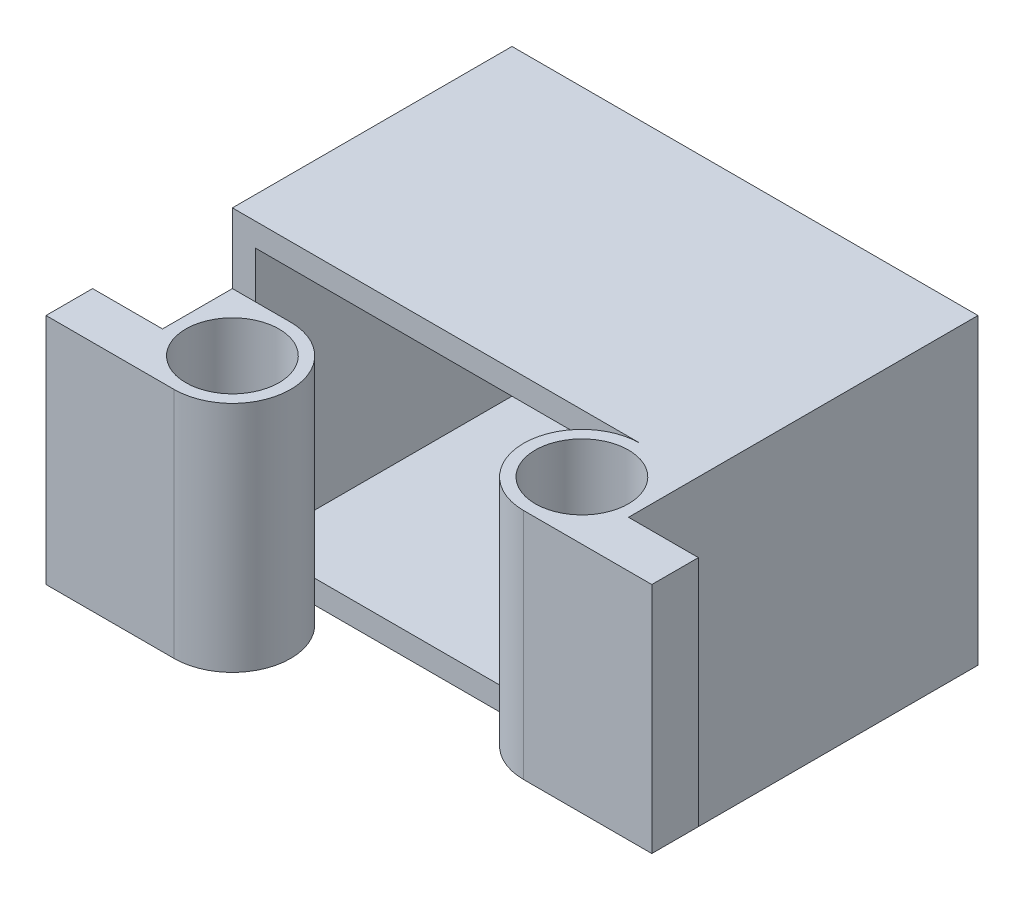
ISO-10303-21;
HEADER;
FILE_DESCRIPTION(('STEP AP214'),'2;1');
FILE_NAME('part.step','',(''),(''),'','','');
FILE_SCHEMA(('AUTOMOTIVE_DESIGN { 1 0 10303 214 1 1 1 1 }'));
ENDSEC;
DATA;
#1=APPLICATION_CONTEXT('core data for automotive mechanical design processes');
#2=APPLICATION_PROTOCOL_DEFINITION('international standard','automotive_design',2000,#1);
#3=PRODUCT_CONTEXT('',#1,'mechanical');
#4=PRODUCT('Part','Part','',(#3));
#5=PRODUCT_RELATED_PRODUCT_CATEGORY('part','',(#4));
#6=PRODUCT_DEFINITION_FORMATION('','',#4);
#7=PRODUCT_DEFINITION_CONTEXT('part definition',#1,'design');
#8=PRODUCT_DEFINITION('design','',#6,#7);
#9=PRODUCT_DEFINITION_SHAPE('','',#8);
#10=(LENGTH_UNIT() NAMED_UNIT(*) SI_UNIT(.MILLI.,.METRE.));
#11=(NAMED_UNIT(*) PLANE_ANGLE_UNIT() SI_UNIT($,.RADIAN.));
#12=(NAMED_UNIT(*) SI_UNIT($,.STERADIAN.) SOLID_ANGLE_UNIT());
#13=UNCERTAINTY_MEASURE_WITH_UNIT(LENGTH_MEASURE(1.E-05),#10,'distance_accuracy_value','');
#14=(GEOMETRIC_REPRESENTATION_CONTEXT(3) GLOBAL_UNCERTAINTY_ASSIGNED_CONTEXT((#13)) GLOBAL_UNIT_ASSIGNED_CONTEXT((#10,
#11,#12)) REPRESENTATION_CONTEXT('',''));
#15=CARTESIAN_POINT('',(0.,0.,0.));
#16=DIRECTION('',(0.,0.,1.));
#17=DIRECTION('',(1.,0.,0.));
#18=AXIS2_PLACEMENT_3D('',#15,#16,#17);
#19=CARTESIAN_POINT('',(20.,-13.,24.));
#20=DIRECTION('',(-1.,0.,0.));
#21=DIRECTION('',(0.,0.,1.));
#22=AXIS2_PLACEMENT_3D('',#19,#20,#21);
#23=PLANE('',#22);
#24=DIRECTION('',(0.,1.,0.));
#25=VECTOR('',#24,1.);
#26=CARTESIAN_POINT('',(20.,13.,30.));
#27=LINE('',#26,#25);
#28=CARTESIAN_POINT('',(20.,-7.,30.));
#29=VERTEX_POINT('',#28);
#30=CARTESIAN_POINT('',(20.,13.,30.));
#31=VERTEX_POINT('',#30);
#32=EDGE_CURVE('E55',#29,#31,#27,.T.);
#33=ORIENTED_EDGE('',*,*,#32,.F.);
#34=DIRECTION('',(0.,0.,1.));
#35=VECTOR('',#34,1.);
#36=CARTESIAN_POINT('',(20.,-7.,0.));
#37=LINE('',#36,#35);
#38=CARTESIAN_POINT('',(20.,-7.,24.));
#39=VERTEX_POINT('',#38);
#40=EDGE_CURVE('E189',#39,#29,#37,.T.);
#41=ORIENTED_EDGE('',*,*,#40,.F.);
#42=DIRECTION('',(0.,1.,0.));
#43=VECTOR('',#42,1.);
#44=CARTESIAN_POINT('',(20.,-13.,24.));
#45=LINE('',#44,#43);
#46=CARTESIAN_POINT('',(20.,-13.,24.));
#47=VERTEX_POINT('',#46);
#48=EDGE_CURVE('E280',#47,#39,#45,.T.);
#49=ORIENTED_EDGE('',*,*,#48,.F.);
#50=DIRECTION('',(0.,0.,-1.));
#51=VECTOR('',#50,1.);
#52=CARTESIAN_POINT('',(20.,-13.,24.));
#53=LINE('',#52,#51);
#54=CARTESIAN_POINT('',(20.,-13.,0.));
#55=VERTEX_POINT('',#54);
#56=EDGE_CURVE('E291',#47,#55,#53,.T.);
#57=ORIENTED_EDGE('',*,*,#56,.T.);
#58=DIRECTION('',(0.,1.,0.));
#59=VECTOR('',#58,1.);
#60=CARTESIAN_POINT('',(20.,-13.,0.));
#61=LINE('',#60,#59);
#62=CARTESIAN_POINT('',(20.,13.,0.));
#63=VERTEX_POINT('',#62);
#64=EDGE_CURVE('E252',#55,#63,#61,.T.);
#65=ORIENTED_EDGE('',*,*,#64,.T.);
#66=DIRECTION('',(0.,0.,-1.));
#67=VECTOR('',#66,1.);
#68=CARTESIAN_POINT('',(20.,13.,24.));
#69=LINE('',#68,#67);
#70=EDGE_CURVE('E305',#31,#63,#69,.T.);
#71=ORIENTED_EDGE('',*,*,#70,.F.);
#72=EDGE_LOOP('',(#33,#41,#49,#57,#65,#71));
#73=FACE_BOUND('',#72,.T.);
#74=ADVANCED_FACE('F39',(#73),#23,.F.);
#75=CARTESIAN_POINT('',(0.,-13.,34.));
#76=DIRECTION('',(0.,0.,1.));
#77=DIRECTION('',(1.,0.,0.));
#78=AXIS2_PLACEMENT_3D('',#75,#76,#77);
#79=PLANE('',#78);
#80=DIRECTION('',(1.,0.,0.));
#81=VECTOR('',#80,1.);
#82=CARTESIAN_POINT('',(0.,7.,34.));
#83=LINE('',#82,#81);
#84=CARTESIAN_POINT('',(-26.,7.,34.));
#85=VERTEX_POINT('',#84);
#86=CARTESIAN_POINT('',(-15.,7.,34.));
#87=VERTEX_POINT('',#86);
#88=EDGE_CURVE('E326',#85,#87,#83,.T.);
#89=ORIENTED_EDGE('',*,*,#88,.F.);
#90=DIRECTION('',(0.,1.,0.));
#91=VECTOR('',#90,1.);
#92=CARTESIAN_POINT('',(-26.,7.,34.));
#93=LINE('',#92,#91);
#94=CARTESIAN_POINT('',(-26.,-13.,34.));
#95=VERTEX_POINT('',#94);
#96=EDGE_CURVE('E308',#95,#85,#93,.T.);
#97=ORIENTED_EDGE('',*,*,#96,.F.);
#98=DIRECTION('',(1.,0.,0.));
#99=VECTOR('',#98,1.);
#100=CARTESIAN_POINT('',(0.,-13.,34.));
#101=LINE('',#100,#99);
#102=CARTESIAN_POINT('',(-15.,-13.,34.));
#103=VERTEX_POINT('',#102);
#104=EDGE_CURVE('E327',#95,#103,#101,.T.);
#105=ORIENTED_EDGE('',*,*,#104,.T.);
#106=DIRECTION('',(0.,1.,0.));
#107=VECTOR('',#106,1.);
#108=CARTESIAN_POINT('',(-15.,-13.,34.));
#109=LINE('',#108,#107);
#110=EDGE_CURVE('E43',#103,#87,#109,.T.);
#111=ORIENTED_EDGE('',*,*,#110,.T.);
#112=EDGE_LOOP('',(#89,#97,#105,#111));
#113=FACE_BOUND('',#112,.T.);
#114=ADVANCED_FACE('F41',(#113),#79,.T.);
#115=CARTESIAN_POINT('',(-20.,-13.,0.));
#116=DIRECTION('',(-1.,0.,0.));
#117=DIRECTION('',(0.,0.,1.));
#118=AXIS2_PLACEMENT_3D('',#115,#116,#117);
#119=PLANE('',#118);
#120=DIRECTION('',(0.,-1.,0.));
#121=VECTOR('',#120,1.);
#122=CARTESIAN_POINT('',(-20.,7.,30.));
#123=LINE('',#122,#121);
#124=CARTESIAN_POINT('',(-20.,7.,30.));
#125=VERTEX_POINT('',#124);
#126=CARTESIAN_POINT('',(-20.,-13.,30.));
#127=VERTEX_POINT('',#126);
#128=EDGE_CURVE('E307',#125,#127,#123,.T.);
#129=ORIENTED_EDGE('',*,*,#128,.F.);
#130=DIRECTION('',(0.,0.,1.));
#131=VECTOR('',#130,1.);
#132=CARTESIAN_POINT('',(-20.,7.,0.));
#133=LINE('',#132,#131);
#134=CARTESIAN_POINT('',(-20.,7.,24.));
#135=VERTEX_POINT('',#134);
#136=EDGE_CURVE('E347',#135,#125,#133,.T.);
#137=ORIENTED_EDGE('',*,*,#136,.F.);
#138=DIRECTION('',(0.,-1.,0.));
#139=VECTOR('',#138,1.);
#140=CARTESIAN_POINT('',(-20.,-13.,24.));
#141=LINE('',#140,#139);
#142=CARTESIAN_POINT('',(-20.,13.,24.));
#143=VERTEX_POINT('',#142);
#144=EDGE_CURVE('E286',#143,#135,#141,.T.);
#145=ORIENTED_EDGE('',*,*,#144,.F.);
#146=DIRECTION('',(0.,0.,-1.));
#147=VECTOR('',#146,1.);
#148=CARTESIAN_POINT('',(-20.,13.,24.));
#149=LINE('',#148,#147);
#150=CARTESIAN_POINT('',(-20.,13.,0.));
#151=VERTEX_POINT('',#150);
#152=EDGE_CURVE('E302',#143,#151,#149,.T.);
#153=ORIENTED_EDGE('',*,*,#152,.T.);
#154=DIRECTION('',(0.,-1.,0.));
#155=VECTOR('',#154,1.);
#156=CARTESIAN_POINT('',(-20.,-13.,0.));
#157=LINE('',#156,#155);
#158=CARTESIAN_POINT('',(-20.,-13.,0.));
#159=VERTEX_POINT('',#158);
#160=EDGE_CURVE('E296',#151,#159,#157,.T.);
#161=ORIENTED_EDGE('',*,*,#160,.T.);
#162=DIRECTION('',(0.,0.,1.));
#163=VECTOR('',#162,1.);
#164=CARTESIAN_POINT('',(-20.,-13.,0.));
#165=LINE('',#164,#163);
#166=EDGE_CURVE('E333',#159,#127,#165,.T.);
#167=ORIENTED_EDGE('',*,*,#166,.T.);
#168=EDGE_LOOP('',(#129,#137,#145,#153,#161,#167));
#169=FACE_BOUND('',#168,.T.);
#170=ADVANCED_FACE('F376',(#169),#119,.T.);
#171=CARTESIAN_POINT('',(0.,-13.,24.));
#172=DIRECTION('',(0.,0.,1.));
#173=DIRECTION('',(1.,0.,0.));
#174=AXIS2_PLACEMENT_3D('',#171,#172,#173);
#175=PLANE('',#174);
#176=DIRECTION('',(1.,0.,0.));
#177=VECTOR('',#176,1.);
#178=CARTESIAN_POINT('',(0.,-11.,24.));
#179=LINE('',#178,#177);
#180=CARTESIAN_POINT('',(-18.,-11.,24.));
#181=VERTEX_POINT('',#180);
#182=CARTESIAN_POINT('',(-15.,-11.,24.));
#183=VERTEX_POINT('',#182);
#184=EDGE_CURVE('E63',#181,#183,#179,.T.);
#185=ORIENTED_EDGE('',*,*,#184,.F.);
#186=DIRECTION('',(0.,-1.,0.));
#187=VECTOR('',#186,1.);
#188=CARTESIAN_POINT('',(-18.,0.,24.));
#189=LINE('',#188,#187);
#190=CARTESIAN_POINT('',(-18.,7.,24.));
#191=VERTEX_POINT('',#190);
#192=EDGE_CURVE('E274',#191,#181,#189,.T.);
#193=ORIENTED_EDGE('',*,*,#192,.F.);
#194=DIRECTION('',(1.,0.,0.));
#195=VECTOR('',#194,1.);
#196=CARTESIAN_POINT('',(0.,7.,24.));
#197=LINE('',#196,#195);
#198=CARTESIAN_POINT('',(-15.,7.,24.));
#199=VERTEX_POINT('',#198);
#200=EDGE_CURVE('E343',#191,#199,#197,.T.);
#201=ORIENTED_EDGE('',*,*,#200,.T.);
#202=DIRECTION('',(0.,1.,0.));
#203=VECTOR('',#202,1.);
#204=CARTESIAN_POINT('',(-15.,-13.,24.));
#205=LINE('',#204,#203);
#206=EDGE_CURVE('E48',#183,#199,#205,.T.);
#207=ORIENTED_EDGE('',*,*,#206,.F.);
#208=EDGE_LOOP('',(#185,#193,#201,#207));
#209=FACE_BOUND('',#208,.T.);
#210=ADVANCED_FACE('F420',(#209),#175,.F.);
#211=CARTESIAN_POINT('',(-15.,-13.,29.));
#212=DIRECTION('',(0.,1.,0.));
#213=DIRECTION('',(0.,0.,1.));
#214=AXIS2_PLACEMENT_3D('',#211,#212,#213);
#215=CYLINDRICAL_SURFACE('',#214,5.);
#216=CARTESIAN_POINT('',(-15.,7.,29.));
#217=DIRECTION('',(0.,1.,0.));
#218=DIRECTION('',(0.,0.,1.));
#219=AXIS2_PLACEMENT_3D('',#216,#217,#218);
#220=CIRCLE('',#219,5.);
#221=EDGE_CURVE('E340',#87,#199,#220,.T.);
#222=ORIENTED_EDGE('',*,*,#221,.F.);
#223=ORIENTED_EDGE('',*,*,#110,.F.);
#224=CARTESIAN_POINT('',(-15.,-13.,29.));
#225=DIRECTION('',(0.,1.,0.));
#226=DIRECTION('',(0.,0.,1.));
#227=AXIS2_PLACEMENT_3D('',#224,#225,#226);
#228=CIRCLE('',#227,5.);
#229=CARTESIAN_POINT('',(-15.,-13.,24.));
#230=VERTEX_POINT('',#229);
#231=EDGE_CURVE('E330',#103,#230,#228,.T.);
#232=ORIENTED_EDGE('',*,*,#231,.T.);
#233=EDGE_CURVE('E11',#230,#183,#205,.T.);
#234=ORIENTED_EDGE('',*,*,#233,.T.);
#235=ORIENTED_EDGE('',*,*,#206,.T.);
#236=EDGE_LOOP('',(#222,#223,#232,#234,#235));
#237=FACE_BOUND('',#236,.T.);
#238=ADVANCED_FACE('F405',(#237),#215,.T.);
#239=CARTESIAN_POINT('',(-15.,-13.,29.));
#240=DIRECTION('',(0.,1.,0.));
#241=DIRECTION('',(0.,0.,1.));
#242=AXIS2_PLACEMENT_3D('',#239,#240,#241);
#243=CYLINDRICAL_SURFACE('',#242,4.);
#244=CARTESIAN_POINT('',(-15.,-13.,29.));
#245=DIRECTION('',(0.,1.,0.));
#246=DIRECTION('',(0.,0.,1.));
#247=AXIS2_PLACEMENT_3D('',#244,#245,#246);
#248=CIRCLE('',#247,4.);
#249=CARTESIAN_POINT('',(-15.,-13.,33.));
#250=VERTEX_POINT('',#249);
#251=EDGE_CURVE('E335',#250,#250,#248,.T.);
#252=ORIENTED_EDGE('',*,*,#251,.F.);
#253=EDGE_LOOP('',(#252));
#254=FACE_BOUND('',#253,.T.);
#255=CARTESIAN_POINT('',(-15.,7.,29.));
#256=DIRECTION('',(0.,1.,0.));
#257=DIRECTION('',(0.,0.,1.));
#258=AXIS2_PLACEMENT_3D('',#255,#256,#257);
#259=CIRCLE('',#258,4.);
#260=CARTESIAN_POINT('',(-15.,7.,33.));
#261=VERTEX_POINT('',#260);
#262=EDGE_CURVE('E331',#261,#261,#259,.T.);
#263=ORIENTED_EDGE('',*,*,#262,.T.);
#264=EDGE_LOOP('',(#263));
#265=FACE_BOUND('',#264,.T.);
#266=ADVANCED_FACE('F353',(#254,#265),#243,.F.);
#267=CARTESIAN_POINT('',(0.,-13.,0.));
#268=DIRECTION('',(0.,1.,0.));
#269=DIRECTION('',(0.,0.,1.));
#270=AXIS2_PLACEMENT_3D('',#267,#268,#269);
#271=PLANE('',#270);
#272=ORIENTED_EDGE('',*,*,#104,.F.);
#273=DIRECTION('',(0.,0.,1.));
#274=VECTOR('',#273,1.);
#275=CARTESIAN_POINT('',(-26.,-13.,34.));
#276=LINE('',#275,#274);
#277=CARTESIAN_POINT('',(-26.,-13.,30.));
#278=VERTEX_POINT('',#277);
#279=EDGE_CURVE('E315',#278,#95,#276,.T.);
#280=ORIENTED_EDGE('',*,*,#279,.F.);
#281=DIRECTION('',(1.,0.,0.));
#282=VECTOR('',#281,1.);
#283=CARTESIAN_POINT('',(-26.,-13.,30.));
#284=LINE('',#283,#282);
#285=EDGE_CURVE('E318',#278,#127,#284,.T.);
#286=ORIENTED_EDGE('',*,*,#285,.T.);
#287=ORIENTED_EDGE('',*,*,#166,.F.);
#288=DIRECTION('',(1.,0.,0.));
#289=VECTOR('',#288,1.);
#290=CARTESIAN_POINT('',(-20.,-13.,0.));
#291=LINE('',#290,#289);
#292=EDGE_CURVE('E284',#159,#55,#291,.T.);
#293=ORIENTED_EDGE('',*,*,#292,.T.);
#294=ORIENTED_EDGE('',*,*,#56,.F.);
#295=DIRECTION('',(1.,0.,0.));
#296=VECTOR('',#295,1.);
#297=CARTESIAN_POINT('',(-20.,-13.,24.));
#298=LINE('',#297,#296);
#299=EDGE_CURVE('E289',#230,#47,#298,.T.);
#300=ORIENTED_EDGE('',*,*,#299,.F.);
#301=ORIENTED_EDGE('',*,*,#231,.F.);
#302=EDGE_LOOP('',(#272,#280,#286,#287,#293,#294,#300,#301));
#303=FACE_BOUND('',#302,.T.);
#304=ORIENTED_EDGE('',*,*,#251,.T.);
#305=EDGE_LOOP('',(#304));
#306=FACE_BOUND('',#305,.T.);
#307=ADVANCED_FACE('F358',(#303,#306),#271,.F.);
#308=CARTESIAN_POINT('',(0.,7.,0.));
#309=DIRECTION('',(0.,1.,0.));
#310=DIRECTION('',(0.,0.,1.));
#311=AXIS2_PLACEMENT_3D('',#308,#309,#310);
#312=PLANE('',#311);
#313=ORIENTED_EDGE('',*,*,#88,.T.);
#314=ORIENTED_EDGE('',*,*,#221,.T.);
#315=ORIENTED_EDGE('',*,*,#200,.F.);
#316=EDGE_CURVE('E344',#135,#191,#197,.T.);
#317=ORIENTED_EDGE('',*,*,#316,.F.);
#318=ORIENTED_EDGE('',*,*,#136,.T.);
#319=DIRECTION('',(1.,0.,0.));
#320=VECTOR('',#319,1.);
#321=CARTESIAN_POINT('',(-26.,7.,30.));
#322=LINE('',#321,#320);
#323=CARTESIAN_POINT('',(-26.,7.,30.));
#324=VERTEX_POINT('',#323);
#325=EDGE_CURVE('E323',#324,#125,#322,.T.);
#326=ORIENTED_EDGE('',*,*,#325,.F.);
#327=DIRECTION('',(0.,0.,-1.));
#328=VECTOR('',#327,1.);
#329=CARTESIAN_POINT('',(-26.,7.,34.));
#330=LINE('',#329,#328);
#331=EDGE_CURVE('E311',#85,#324,#330,.T.);
#332=ORIENTED_EDGE('',*,*,#331,.F.);
#333=EDGE_LOOP('',(#313,#314,#315,#317,#318,#326,#332));
#334=FACE_BOUND('',#333,.T.);
#335=ORIENTED_EDGE('',*,*,#262,.F.);
#336=EDGE_LOOP('',(#335));
#337=FACE_BOUND('',#336,.T.);
#338=ADVANCED_FACE('F355',(#334,#337),#312,.T.);
#339=CARTESIAN_POINT('',(-26.,7.,30.));
#340=DIRECTION('',(0.,0.,1.));
#341=DIRECTION('',(1.,0.,0.));
#342=AXIS2_PLACEMENT_3D('',#339,#340,#341);
#343=PLANE('',#342);
#344=ORIENTED_EDGE('',*,*,#128,.T.);
#345=ORIENTED_EDGE('',*,*,#285,.F.);
#346=DIRECTION('',(0.,-1.,0.));
#347=VECTOR('',#346,1.);
#348=CARTESIAN_POINT('',(-26.,7.,30.));
#349=LINE('',#348,#347);
#350=EDGE_CURVE('E313',#324,#278,#349,.T.);
#351=ORIENTED_EDGE('',*,*,#350,.F.);
#352=ORIENTED_EDGE('',*,*,#325,.T.);
#353=EDGE_LOOP('',(#344,#345,#351,#352));
#354=FACE_BOUND('',#353,.T.);
#355=ADVANCED_FACE('F357',(#354),#343,.F.);
#356=CARTESIAN_POINT('',(-26.,0.,0.));
#357=DIRECTION('',(1.,0.,0.));
#358=DIRECTION('',(0.,0.,-1.));
#359=AXIS2_PLACEMENT_3D('',#356,#357,#358);
#360=PLANE('',#359);
#361=ORIENTED_EDGE('',*,*,#96,.T.);
#362=ORIENTED_EDGE('',*,*,#331,.T.);
#363=ORIENTED_EDGE('',*,*,#350,.T.);
#364=ORIENTED_EDGE('',*,*,#279,.T.);
#365=EDGE_LOOP('',(#361,#362,#363,#364));
#366=FACE_BOUND('',#365,.T.);
#367=ADVANCED_FACE('F365',(#366),#360,.F.);
#368=CARTESIAN_POINT('',(0.,0.,24.));
#369=DIRECTION('',(0.,0.,-1.));
#370=DIRECTION('',(-1.,0.,0.));
#371=AXIS2_PLACEMENT_3D('',#368,#369,#370);
#372=PLANE('',#371);
#373=CARTESIAN_POINT('',(18.,-11.,24.));
#374=VERTEX_POINT('',#373);
#375=EDGE_CURVE('E278',#183,#374,#179,.T.);
#376=ORIENTED_EDGE('',*,*,#375,.F.);
#377=ORIENTED_EDGE('',*,*,#233,.F.);
#378=ORIENTED_EDGE('',*,*,#299,.T.);
#379=ORIENTED_EDGE('',*,*,#48,.T.);
#380=DIRECTION('',(1.,0.,0.));
#381=VECTOR('',#380,1.);
#382=CARTESIAN_POINT('',(0.,-7.,24.));
#383=LINE('',#382,#381);
#384=CARTESIAN_POINT('',(18.,-7.,24.));
#385=VERTEX_POINT('',#384);
#386=EDGE_CURVE('E219',#385,#39,#383,.T.);
#387=ORIENTED_EDGE('',*,*,#386,.F.);
#388=DIRECTION('',(0.,1.,0.));
#389=VECTOR('',#388,1.);
#390=CARTESIAN_POINT('',(18.,0.,24.));
#391=LINE('',#390,#389);
#392=EDGE_CURVE('E267',#374,#385,#391,.T.);
#393=ORIENTED_EDGE('',*,*,#392,.F.);
#394=EDGE_LOOP('',(#376,#377,#378,#379,#387,#393));
#395=FACE_BOUND('',#394,.T.);
#396=ADVANCED_FACE('F383',(#395),#372,.F.);
#397=ORIENTED_EDGE('',*,*,#316,.T.);
#398=CARTESIAN_POINT('',(-18.,11.,24.));
#399=VERTEX_POINT('',#398);
#400=EDGE_CURVE('E275',#399,#191,#189,.T.);
#401=ORIENTED_EDGE('',*,*,#400,.F.);
#402=DIRECTION('',(-1.,0.,0.));
#403=VECTOR('',#402,1.);
#404=CARTESIAN_POINT('',(0.,11.,24.));
#405=LINE('',#404,#403);
#406=CARTESIAN_POINT('',(15.,11.,24.));
#407=VERTEX_POINT('',#406);
#408=EDGE_CURVE('E270',#407,#399,#405,.T.);
#409=ORIENTED_EDGE('',*,*,#408,.F.);
#410=DIRECTION('',(0.,1.,0.));
#411=VECTOR('',#410,1.);
#412=CARTESIAN_POINT('',(15.,-7.,24.));
#413=LINE('',#412,#411);
#414=CARTESIAN_POINT('',(15.,13.,24.));
#415=VERTEX_POINT('',#414);
#416=EDGE_CURVE('E225',#407,#415,#413,.T.);
#417=ORIENTED_EDGE('',*,*,#416,.T.);
#418=DIRECTION('',(-1.,0.,0.));
#419=VECTOR('',#418,1.);
#420=CARTESIAN_POINT('',(-20.,13.,24.));
#421=LINE('',#420,#419);
#422=EDGE_CURVE('E283',#415,#143,#421,.T.);
#423=ORIENTED_EDGE('',*,*,#422,.T.);
#424=ORIENTED_EDGE('',*,*,#144,.T.);
#425=EDGE_LOOP('',(#397,#401,#409,#417,#423,#424));
#426=FACE_BOUND('',#425,.T.);
#427=ADVANCED_FACE('F388',(#426),#372,.F.);
#428=CARTESIAN_POINT('',(-20.,13.,24.));
#429=DIRECTION('',(0.,-1.,0.));
#430=DIRECTION('',(0.,0.,-1.));
#431=AXIS2_PLACEMENT_3D('',#428,#429,#430);
#432=PLANE('',#431);
#433=DIRECTION('',(-1.,0.,0.));
#434=VECTOR('',#433,1.);
#435=CARTESIAN_POINT('',(-20.,13.,0.));
#436=LINE('',#435,#434);
#437=EDGE_CURVE('E294',#63,#151,#436,.T.);
#438=ORIENTED_EDGE('',*,*,#437,.T.);
#439=ORIENTED_EDGE('',*,*,#152,.F.);
#440=ORIENTED_EDGE('',*,*,#422,.F.);
#441=CARTESIAN_POINT('',(15.,13.,29.));
#442=DIRECTION('',(0.,1.,0.));
#443=DIRECTION('',(0.,0.,1.));
#444=AXIS2_PLACEMENT_3D('',#441,#442,#443);
#445=CIRCLE('',#444,5.);
#446=CARTESIAN_POINT('',(15.,13.,34.));
#447=VERTEX_POINT('',#446);
#448=EDGE_CURVE('E216',#415,#447,#445,.T.);
#449=ORIENTED_EDGE('',*,*,#448,.T.);
#450=DIRECTION('',(1.,0.,0.));
#451=VECTOR('',#450,1.);
#452=CARTESIAN_POINT('',(0.,13.,34.));
#453=LINE('',#452,#451);
#454=CARTESIAN_POINT('',(26.,13.,34.));
#455=VERTEX_POINT('',#454);
#456=EDGE_CURVE('E228',#447,#455,#453,.T.);
#457=ORIENTED_EDGE('',*,*,#456,.T.);
#458=DIRECTION('',(0.,0.,1.));
#459=VECTOR('',#458,1.);
#460=CARTESIAN_POINT('',(26.,13.,34.));
#461=LINE('',#460,#459);
#462=CARTESIAN_POINT('',(26.,13.,30.));
#463=VERTEX_POINT('',#462);
#464=EDGE_CURVE('E206',#463,#455,#461,.T.);
#465=ORIENTED_EDGE('',*,*,#464,.F.);
#466=DIRECTION('',(-1.,0.,0.));
#467=VECTOR('',#466,1.);
#468=CARTESIAN_POINT('',(26.,13.,30.));
#469=LINE('',#468,#467);
#470=EDGE_CURVE('E211',#463,#31,#469,.T.);
#471=ORIENTED_EDGE('',*,*,#470,.T.);
#472=ORIENTED_EDGE('',*,*,#70,.T.);
#473=EDGE_LOOP('',(#438,#439,#440,#449,#457,#465,#471,#472));
#474=FACE_BOUND('',#473,.T.);
#475=CARTESIAN_POINT('',(15.,13.,29.));
#476=DIRECTION('',(0.,1.,0.));
#477=DIRECTION('',(0.,0.,1.));
#478=AXIS2_PLACEMENT_3D('',#475,#476,#477);
#479=CIRCLE('',#478,4.);
#480=CARTESIAN_POINT('',(15.,13.,33.));
#481=VERTEX_POINT('',#480);
#482=EDGE_CURVE('E230',#481,#481,#479,.T.);
#483=ORIENTED_EDGE('',*,*,#482,.F.);
#484=EDGE_LOOP('',(#483));
#485=FACE_BOUND('',#484,.T.);
#486=ADVANCED_FACE('F380',(#474,#485),#432,.F.);
#487=CARTESIAN_POINT('',(0.,0.,0.));
#488=DIRECTION('',(0.,0.,-1.));
#489=DIRECTION('',(-1.,0.,0.));
#490=AXIS2_PLACEMENT_3D('',#487,#488,#489);
#491=PLANE('',#490);
#492=ORIENTED_EDGE('',*,*,#64,.F.);
#493=ORIENTED_EDGE('',*,*,#292,.F.);
#494=ORIENTED_EDGE('',*,*,#160,.F.);
#495=ORIENTED_EDGE('',*,*,#437,.F.);
#496=EDGE_LOOP('',(#492,#493,#494,#495));
#497=FACE_BOUND('',#496,.T.);
#498=ADVANCED_FACE('F431',(#497),#491,.T.);
#499=CARTESIAN_POINT('',(18.,-13.,24.));
#500=DIRECTION('',(-1.,0.,0.));
#501=DIRECTION('',(0.,0.,1.));
#502=AXIS2_PLACEMENT_3D('',#499,#500,#501);
#503=PLANE('',#502);
#504=DIRECTION('',(0.,1.,0.));
#505=VECTOR('',#504,1.);
#506=CARTESIAN_POINT('',(18.,0.,2.));
#507=LINE('',#506,#505);
#508=CARTESIAN_POINT('',(18.,-11.,2.));
#509=VERTEX_POINT('',#508);
#510=CARTESIAN_POINT('',(18.,11.,2.));
#511=VERTEX_POINT('',#510);
#512=EDGE_CURVE('E243',#509,#511,#507,.T.);
#513=ORIENTED_EDGE('',*,*,#512,.F.);
#514=DIRECTION('',(0.,0.,-1.));
#515=VECTOR('',#514,1.);
#516=CARTESIAN_POINT('',(18.,-11.,24.));
#517=LINE('',#516,#515);
#518=EDGE_CURVE('E254',#374,#509,#517,.T.);
#519=ORIENTED_EDGE('',*,*,#518,.F.);
#520=ORIENTED_EDGE('',*,*,#392,.T.);
#521=DIRECTION('',(0.,1.,0.));
#522=VECTOR('',#521,1.);
#523=CARTESIAN_POINT('',(18.,-13.,24.));
#524=LINE('',#523,#522);
#525=CARTESIAN_POINT('',(18.,11.,24.));
#526=VERTEX_POINT('',#525);
#527=EDGE_CURVE('E234',#385,#526,#524,.T.);
#528=ORIENTED_EDGE('',*,*,#527,.T.);
#529=DIRECTION('',(0.,0.,-1.));
#530=VECTOR('',#529,1.);
#531=CARTESIAN_POINT('',(18.,11.,24.));
#532=LINE('',#531,#530);
#533=EDGE_CURVE('E249',#526,#511,#532,.T.);
#534=ORIENTED_EDGE('',*,*,#533,.T.);
#535=EDGE_LOOP('',(#513,#519,#520,#528,#534));
#536=FACE_BOUND('',#535,.T.);
#537=ADVANCED_FACE('F451',(#536),#503,.T.);
#538=CARTESIAN_POINT('',(-20.,11.,24.));
#539=DIRECTION('',(0.,-1.,0.));
#540=DIRECTION('',(0.,0.,-1.));
#541=AXIS2_PLACEMENT_3D('',#538,#539,#540);
#542=PLANE('',#541);
#543=DIRECTION('',(-1.,0.,0.));
#544=VECTOR('',#543,1.);
#545=CARTESIAN_POINT('',(0.,11.,2.));
#546=LINE('',#545,#544);
#547=CARTESIAN_POINT('',(-18.,11.,2.));
#548=VERTEX_POINT('',#547);
#549=EDGE_CURVE('E248',#511,#548,#546,.T.);
#550=ORIENTED_EDGE('',*,*,#549,.F.);
#551=ORIENTED_EDGE('',*,*,#533,.F.);
#552=EDGE_CURVE('E271',#526,#407,#405,.T.);
#553=ORIENTED_EDGE('',*,*,#552,.T.);
#554=ORIENTED_EDGE('',*,*,#408,.T.);
#555=DIRECTION('',(0.,0.,-1.));
#556=VECTOR('',#555,1.);
#557=CARTESIAN_POINT('',(-18.,11.,24.));
#558=LINE('',#557,#556);
#559=EDGE_CURVE('E253',#399,#548,#558,.T.);
#560=ORIENTED_EDGE('',*,*,#559,.T.);
#561=EDGE_LOOP('',(#550,#551,#553,#554,#560));
#562=FACE_BOUND('',#561,.T.);
#563=ADVANCED_FACE('F445',(#562),#542,.T.);
#564=CARTESIAN_POINT('',(-18.,-13.,24.));
#565=DIRECTION('',(1.,0.,0.));
#566=DIRECTION('',(0.,0.,-1.));
#567=AXIS2_PLACEMENT_3D('',#564,#565,#566);
#568=PLANE('',#567);
#569=DIRECTION('',(0.,-1.,0.));
#570=VECTOR('',#569,1.);
#571=CARTESIAN_POINT('',(-18.,0.,2.));
#572=LINE('',#571,#570);
#573=CARTESIAN_POINT('',(-18.,-11.,2.));
#574=VERTEX_POINT('',#573);
#575=EDGE_CURVE('E259',#548,#574,#572,.T.);
#576=ORIENTED_EDGE('',*,*,#575,.F.);
#577=ORIENTED_EDGE('',*,*,#559,.F.);
#578=ORIENTED_EDGE('',*,*,#400,.T.);
#579=ORIENTED_EDGE('',*,*,#192,.T.);
#580=DIRECTION('',(0.,0.,-1.));
#581=VECTOR('',#580,1.);
#582=CARTESIAN_POINT('',(-18.,-11.,24.));
#583=LINE('',#582,#581);
#584=EDGE_CURVE('E257',#181,#574,#583,.T.);
#585=ORIENTED_EDGE('',*,*,#584,.T.);
#586=EDGE_LOOP('',(#576,#577,#578,#579,#585));
#587=FACE_BOUND('',#586,.T.);
#588=ADVANCED_FACE('F416',(#587),#568,.T.);
#589=CARTESIAN_POINT('',(-20.,-11.,24.));
#590=DIRECTION('',(0.,1.,0.));
#591=DIRECTION('',(0.,0.,1.));
#592=AXIS2_PLACEMENT_3D('',#589,#590,#591);
#593=PLANE('',#592);
#594=DIRECTION('',(1.,0.,0.));
#595=VECTOR('',#594,1.);
#596=CARTESIAN_POINT('',(0.,-11.,2.));
#597=LINE('',#596,#595);
#598=EDGE_CURVE('E263',#574,#509,#597,.T.);
#599=ORIENTED_EDGE('',*,*,#598,.F.);
#600=ORIENTED_EDGE('',*,*,#584,.F.);
#601=ORIENTED_EDGE('',*,*,#184,.T.);
#602=ORIENTED_EDGE('',*,*,#375,.T.);
#603=ORIENTED_EDGE('',*,*,#518,.T.);
#604=EDGE_LOOP('',(#599,#600,#601,#602,#603));
#605=FACE_BOUND('',#604,.T.);
#606=ADVANCED_FACE('F413',(#605),#593,.T.);
#607=CARTESIAN_POINT('',(0.,0.,2.));
#608=DIRECTION('',(0.,0.,-1.));
#609=DIRECTION('',(-1.,0.,0.));
#610=AXIS2_PLACEMENT_3D('',#607,#608,#609);
#611=PLANE('',#610);
#612=CARTESIAN_POINT('',(0.,0.,2.));
#613=DIRECTION('',(0.,0.,1.));
#614=DIRECTION('',(1.,0.,0.));
#615=AXIS2_PLACEMENT_3D('',#612,#613,#614);
#616=CIRCLE('',#615,9.8);
#617=CARTESIAN_POINT('',(9.8,0.,2.));
#618=VERTEX_POINT('',#617);
#619=EDGE_CURVE('E239',#618,#618,#616,.T.);
#620=ORIENTED_EDGE('',*,*,#619,.F.);
#621=EDGE_LOOP('',(#620));
#622=FACE_BOUND('',#621,.T.);
#623=ORIENTED_EDGE('',*,*,#512,.T.);
#624=ORIENTED_EDGE('',*,*,#549,.T.);
#625=ORIENTED_EDGE('',*,*,#575,.T.);
#626=ORIENTED_EDGE('',*,*,#598,.T.);
#627=EDGE_LOOP('',(#623,#624,#625,#626));
#628=FACE_BOUND('',#627,.T.);
#629=ADVANCED_FACE('F453',(#622,#628),#611,.F.);
#630=CARTESIAN_POINT('',(0.,0.,1.6));
#631=DIRECTION('',(0.,0.,1.));
#632=DIRECTION('',(1.,0.,0.));
#633=AXIS2_PLACEMENT_3D('',#630,#631,#632);
#634=CYLINDRICAL_SURFACE('',#633,9.8);
#635=CARTESIAN_POINT('',(0.,0.,1.6));
#636=DIRECTION('',(0.,0.,1.));
#637=DIRECTION('',(1.,0.,0.));
#638=AXIS2_PLACEMENT_3D('',#635,#636,#637);
#639=CIRCLE('',#638,9.8);
#640=CARTESIAN_POINT('',(9.8,0.,1.6));
#641=VERTEX_POINT('',#640);
#642=EDGE_CURVE('E240',#641,#641,#639,.T.);
#643=ORIENTED_EDGE('',*,*,#642,.F.);
#644=EDGE_LOOP('',(#643));
#645=FACE_BOUND('',#644,.T.);
#646=ORIENTED_EDGE('',*,*,#619,.T.);
#647=EDGE_LOOP('',(#646));
#648=FACE_BOUND('',#647,.T.);
#649=ADVANCED_FACE('F455',(#645,#648),#634,.F.);
#650=CARTESIAN_POINT('',(0.,0.,1.6));
#651=DIRECTION('',(0.,0.,1.));
#652=DIRECTION('',(1.,0.,0.));
#653=AXIS2_PLACEMENT_3D('',#650,#651,#652);
#654=PLANE('',#653);
#655=ORIENTED_EDGE('',*,*,#642,.T.);
#656=EDGE_LOOP('',(#655));
#657=FACE_BOUND('',#656,.T.);
#658=ADVANCED_FACE('F462',(#657),#654,.T.);
#659=CARTESIAN_POINT('',(0.,-7.,24.));
#660=DIRECTION('',(0.,0.,1.));
#661=DIRECTION('',(1.,0.,0.));
#662=AXIS2_PLACEMENT_3D('',#659,#660,#661);
#663=PLANE('',#662);
#664=ORIENTED_EDGE('',*,*,#527,.F.);
#665=CARTESIAN_POINT('',(15.,-7.,24.));
#666=VERTEX_POINT('',#665);
#667=EDGE_CURVE('E217',#666,#385,#383,.T.);
#668=ORIENTED_EDGE('',*,*,#667,.F.);
#669=EDGE_CURVE('E235',#666,#407,#413,.T.);
#670=ORIENTED_EDGE('',*,*,#669,.T.);
#671=ORIENTED_EDGE('',*,*,#552,.F.);
#672=EDGE_LOOP('',(#664,#668,#670,#671));
#673=FACE_BOUND('',#672,.T.);
#674=ADVANCED_FACE('F447',(#673),#663,.F.);
#675=CARTESIAN_POINT('',(0.,-7.,34.));
#676=DIRECTION('',(0.,0.,1.));
#677=DIRECTION('',(1.,0.,0.));
#678=AXIS2_PLACEMENT_3D('',#675,#676,#677);
#679=PLANE('',#678);
#680=ORIENTED_EDGE('',*,*,#456,.F.);
#681=DIRECTION('',(0.,1.,0.));
#682=VECTOR('',#681,1.);
#683=CARTESIAN_POINT('',(15.,-7.,34.));
#684=LINE('',#683,#682);
#685=CARTESIAN_POINT('',(15.,-7.,34.));
#686=VERTEX_POINT('',#685);
#687=EDGE_CURVE('E185',#686,#447,#684,.T.);
#688=ORIENTED_EDGE('',*,*,#687,.F.);
#689=DIRECTION('',(1.,0.,0.));
#690=VECTOR('',#689,1.);
#691=CARTESIAN_POINT('',(0.,-7.,34.));
#692=LINE('',#691,#690);
#693=CARTESIAN_POINT('',(26.,-7.,34.));
#694=VERTEX_POINT('',#693);
#695=EDGE_CURVE('E179',#686,#694,#692,.T.);
#696=ORIENTED_EDGE('',*,*,#695,.T.);
#697=DIRECTION('',(0.,-1.,0.));
#698=VECTOR('',#697,1.);
#699=CARTESIAN_POINT('',(26.,13.,34.));
#700=LINE('',#699,#698);
#701=EDGE_CURVE('E184',#455,#694,#700,.T.);
#702=ORIENTED_EDGE('',*,*,#701,.F.);
#703=EDGE_LOOP('',(#680,#688,#696,#702));
#704=FACE_BOUND('',#703,.T.);
#705=ADVANCED_FACE('F182',(#704),#679,.T.);
#706=CARTESIAN_POINT('',(15.,-7.,29.));
#707=DIRECTION('',(0.,1.,0.));
#708=DIRECTION('',(0.,0.,1.));
#709=AXIS2_PLACEMENT_3D('',#706,#707,#708);
#710=CYLINDRICAL_SURFACE('',#709,5.);
#711=ORIENTED_EDGE('',*,*,#448,.F.);
#712=ORIENTED_EDGE('',*,*,#416,.F.);
#713=ORIENTED_EDGE('',*,*,#669,.F.);
#714=CARTESIAN_POINT('',(15.,-7.,29.));
#715=DIRECTION('',(0.,1.,0.));
#716=DIRECTION('',(0.,0.,1.));
#717=AXIS2_PLACEMENT_3D('',#714,#715,#716);
#718=CIRCLE('',#717,5.);
#719=EDGE_CURVE('E190',#666,#686,#718,.T.);
#720=ORIENTED_EDGE('',*,*,#719,.T.);
#721=ORIENTED_EDGE('',*,*,#687,.T.);
#722=EDGE_LOOP('',(#711,#712,#713,#720,#721));
#723=FACE_BOUND('',#722,.T.);
#724=ADVANCED_FACE('F442',(#723),#710,.T.);
#725=CARTESIAN_POINT('',(15.,-7.,29.));
#726=DIRECTION('',(0.,1.,0.));
#727=DIRECTION('',(0.,0.,1.));
#728=AXIS2_PLACEMENT_3D('',#725,#726,#727);
#729=CYLINDRICAL_SURFACE('',#728,4.);
#730=CARTESIAN_POINT('',(15.,-7.,29.));
#731=DIRECTION('',(0.,1.,0.));
#732=DIRECTION('',(0.,0.,1.));
#733=AXIS2_PLACEMENT_3D('',#730,#731,#732);
#734=CIRCLE('',#733,4.);
#735=CARTESIAN_POINT('',(15.,-7.,33.));
#736=VERTEX_POINT('',#735);
#737=EDGE_CURVE('E222',#736,#736,#734,.T.);
#738=ORIENTED_EDGE('',*,*,#737,.F.);
#739=EDGE_LOOP('',(#738));
#740=FACE_BOUND('',#739,.T.);
#741=ORIENTED_EDGE('',*,*,#482,.T.);
#742=EDGE_LOOP('',(#741));
#743=FACE_BOUND('',#742,.T.);
#744=ADVANCED_FACE('F586',(#740,#743),#729,.F.);
#745=CARTESIAN_POINT('',(0.,-7.,0.));
#746=DIRECTION('',(0.,1.,0.));
#747=DIRECTION('',(0.,0.,1.));
#748=AXIS2_PLACEMENT_3D('',#745,#746,#747);
#749=PLANE('',#748);
#750=ORIENTED_EDGE('',*,*,#667,.T.);
#751=ORIENTED_EDGE('',*,*,#386,.T.);
#752=ORIENTED_EDGE('',*,*,#40,.T.);
#753=DIRECTION('',(-1.,0.,0.));
#754=VECTOR('',#753,1.);
#755=CARTESIAN_POINT('',(26.,-7.,30.));
#756=LINE('',#755,#754);
#757=CARTESIAN_POINT('',(26.,-7.,30.));
#758=VERTEX_POINT('',#757);
#759=EDGE_CURVE('E198',#758,#29,#756,.T.);
#760=ORIENTED_EDGE('',*,*,#759,.F.);
#761=DIRECTION('',(0.,0.,-1.));
#762=VECTOR('',#761,1.);
#763=CARTESIAN_POINT('',(26.,-7.,34.));
#764=LINE('',#763,#762);
#765=EDGE_CURVE('E193',#694,#758,#764,.T.);
#766=ORIENTED_EDGE('',*,*,#765,.F.);
#767=ORIENTED_EDGE('',*,*,#695,.F.);
#768=ORIENTED_EDGE('',*,*,#719,.F.);
#769=EDGE_LOOP('',(#750,#751,#752,#760,#766,#767,#768));
#770=FACE_BOUND('',#769,.T.);
#771=ORIENTED_EDGE('',*,*,#737,.T.);
#772=EDGE_LOOP('',(#771));
#773=FACE_BOUND('',#772,.T.);
#774=ADVANCED_FACE('F195',(#770,#773),#749,.F.);
#775=CARTESIAN_POINT('',(26.,13.,30.));
#776=DIRECTION('',(0.,0.,1.));
#777=DIRECTION('',(0.,-1.,0.));
#778=AXIS2_PLACEMENT_3D('',#775,#776,#777);
#779=PLANE('',#778);
#780=ORIENTED_EDGE('',*,*,#32,.T.);
#781=ORIENTED_EDGE('',*,*,#470,.F.);
#782=DIRECTION('',(0.,1.,0.));
#783=VECTOR('',#782,1.);
#784=CARTESIAN_POINT('',(26.,13.,30.));
#785=LINE('',#784,#783);
#786=EDGE_CURVE('E201',#758,#463,#785,.T.);
#787=ORIENTED_EDGE('',*,*,#786,.F.);
#788=ORIENTED_EDGE('',*,*,#759,.T.);
#789=EDGE_LOOP('',(#780,#781,#787,#788));
#790=FACE_BOUND('',#789,.T.);
#791=ADVANCED_FACE('F438',(#790),#779,.F.);
#792=CARTESIAN_POINT('',(26.,0.,0.));
#793=DIRECTION('',(1.,0.,0.));
#794=DIRECTION('',(0.,0.,-1.));
#795=AXIS2_PLACEMENT_3D('',#792,#793,#794);
#796=PLANE('',#795);
#797=ORIENTED_EDGE('',*,*,#701,.T.);
#798=ORIENTED_EDGE('',*,*,#765,.T.);
#799=ORIENTED_EDGE('',*,*,#786,.T.);
#800=ORIENTED_EDGE('',*,*,#464,.T.);
#801=EDGE_LOOP('',(#797,#798,#799,#800));
#802=FACE_BOUND('',#801,.T.);
#803=ADVANCED_FACE('F204',(#802),#796,.T.);
#804=CLOSED_SHELL('',(#74,#114,#170,#210,#238,#266,#307,#338,#355,#367,#396,#427,#486,#498,#537,
#563,#588,#606,#629,#649,#658,#674,#705,#724,#744,#774,#791,#803));
#805=MANIFOLD_SOLID_BREP('B2',#804);
#806=ADVANCED_BREP_SHAPE_REPRESENTATION('',(#18,#805),#14);
#807=SHAPE_DEFINITION_REPRESENTATION(#9,#806);
ENDSEC;
END-ISO-10303-21;
